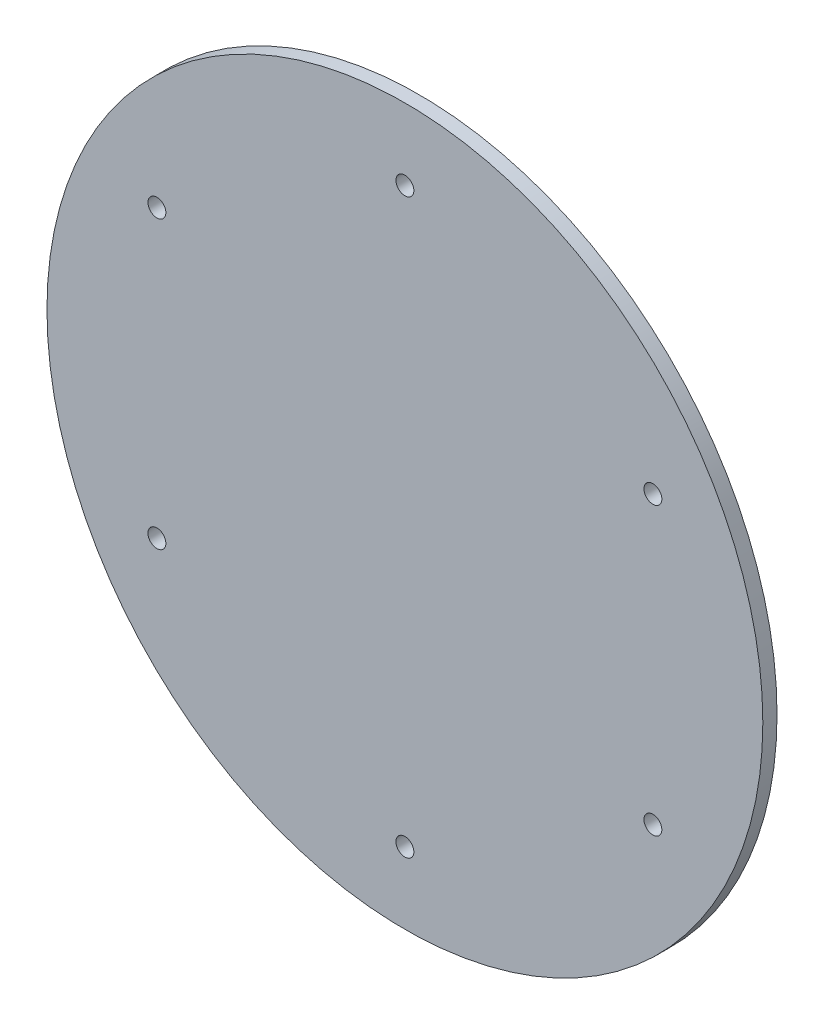
ISO-10303-21;
HEADER;
FILE_DESCRIPTION(('STEP AP214'),'2;1');
FILE_NAME('part.step','',(''),(''),'','','');
FILE_SCHEMA(('AUTOMOTIVE_DESIGN { 1 0 10303 214 1 1 1 1 }'));
ENDSEC;
DATA;
#1=APPLICATION_CONTEXT('core data for automotive mechanical design processes');
#2=APPLICATION_PROTOCOL_DEFINITION('international standard','automotive_design',2000,#1);
#3=PRODUCT_CONTEXT('',#1,'mechanical');
#4=PRODUCT('Part','Part','',(#3));
#5=PRODUCT_RELATED_PRODUCT_CATEGORY('part','',(#4));
#6=PRODUCT_DEFINITION_FORMATION('','',#4);
#7=PRODUCT_DEFINITION_CONTEXT('part definition',#1,'design');
#8=PRODUCT_DEFINITION('design','',#6,#7);
#9=PRODUCT_DEFINITION_SHAPE('','',#8);
#10=(LENGTH_UNIT() NAMED_UNIT(*) SI_UNIT(.MILLI.,.METRE.));
#11=(NAMED_UNIT(*) PLANE_ANGLE_UNIT() SI_UNIT($,.RADIAN.));
#12=(NAMED_UNIT(*) SI_UNIT($,.STERADIAN.) SOLID_ANGLE_UNIT());
#13=UNCERTAINTY_MEASURE_WITH_UNIT(LENGTH_MEASURE(1.E-05),#10,'distance_accuracy_value','');
#14=(GEOMETRIC_REPRESENTATION_CONTEXT(3) GLOBAL_UNCERTAINTY_ASSIGNED_CONTEXT((#13)) GLOBAL_UNIT_ASSIGNED_CONTEXT((#10,
#11,#12)) REPRESENTATION_CONTEXT('',''));
#15=CARTESIAN_POINT('',(0.,0.,0.));
#16=DIRECTION('',(0.,0.,1.));
#17=DIRECTION('',(1.,0.,0.));
#18=AXIS2_PLACEMENT_3D('',#15,#16,#17);
#19=CARTESIAN_POINT('',(0.,0.,3.175));
#20=DIRECTION('',(0.,0.,1.));
#21=DIRECTION('',(1.,0.,0.));
#22=AXIS2_PLACEMENT_3D('',#19,#20,#21);
#23=PLANE('',#22);
#24=CARTESIAN_POINT('',(-55.4256258422,-32.0000000000024,3.175));
#25=DIRECTION('',(0.,0.,1.));
#26=DIRECTION('',(1.,0.,0.));
#27=AXIS2_PLACEMENT_3D('',#24,#25,#26);
#28=CIRCLE('',#27,2.00000000000518);
#29=CARTESIAN_POINT('',(-53.4256258421948,-32.0000000000024,3.175));
#30=VERTEX_POINT('',#29);
#31=EDGE_CURVE('E65',#30,#30,#28,.T.);
#32=ORIENTED_EDGE('',*,*,#31,.F.);
#33=EDGE_LOOP('',(#32));
#34=FACE_BOUND('',#33,.T.);
#35=CARTESIAN_POINT('',(55.4256258422082,-31.9999999999976,3.175));
#36=DIRECTION('',(0.,0.,1.));
#37=DIRECTION('',(1.,0.,0.));
#38=AXIS2_PLACEMENT_3D('',#35,#36,#37);
#39=CIRCLE('',#38,2.00000000000351);
#40=CARTESIAN_POINT('',(57.4256258422117,-31.9999999999976,3.175));
#41=VERTEX_POINT('',#40);
#42=EDGE_CURVE('E53',#41,#41,#39,.T.);
#43=ORIENTED_EDGE('',*,*,#42,.F.);
#44=EDGE_LOOP('',(#43));
#45=FACE_BOUND('',#44,.T.);
#46=CARTESIAN_POINT('',(0.,64.,3.175));
#47=DIRECTION('',(0.,0.,1.));
#48=DIRECTION('',(1.,0.,0.));
#49=AXIS2_PLACEMENT_3D('',#46,#47,#48);
#50=CIRCLE('',#49,2.);
#51=CARTESIAN_POINT('',(2.,64.,3.175));
#52=VERTEX_POINT('',#51);
#53=EDGE_CURVE('E42',#52,#52,#50,.T.);
#54=ORIENTED_EDGE('',*,*,#53,.F.);
#55=EDGE_LOOP('',(#54));
#56=FACE_BOUND('',#55,.T.);
#57=CARTESIAN_POINT('',(0.,0.,3.175));
#58=DIRECTION('',(0.,0.,1.));
#59=DIRECTION('',(1.,0.,0.));
#60=AXIS2_PLACEMENT_3D('',#57,#58,#59);
#61=CIRCLE('',#60,80.);
#62=CARTESIAN_POINT('',(80.,0.,3.175));
#63=VERTEX_POINT('',#62);
#64=EDGE_CURVE('E10',#63,#63,#61,.T.);
#65=ORIENTED_EDGE('',*,*,#64,.T.);
#66=EDGE_LOOP('',(#65));
#67=FACE_BOUND('',#66,.T.);
#68=CARTESIAN_POINT('',(55.4256258422054,32.0000000000024,3.175));
#69=DIRECTION('',(0.,0.,1.));
#70=DIRECTION('',(1.,0.,0.));
#71=AXIS2_PLACEMENT_3D('',#68,#69,#70);
#72=CIRCLE('',#71,2.00000000000077);
#73=CARTESIAN_POINT('',(57.4256258422062,32.0000000000024,3.175));
#74=VERTEX_POINT('',#73);
#75=EDGE_CURVE('E47',#74,#74,#72,.T.);
#76=ORIENTED_EDGE('',*,*,#75,.F.);
#77=EDGE_LOOP('',(#76));
#78=FACE_BOUND('',#77,.T.);
#79=CARTESIAN_POINT('',(5.44129273160848E-12,-64.,3.175));
#80=DIRECTION('',(0.,0.,1.));
#81=DIRECTION('',(1.,0.,0.));
#82=AXIS2_PLACEMENT_3D('',#79,#80,#81);
#83=CIRCLE('',#82,2.00000000000563);
#84=CARTESIAN_POINT('',(2.00000000001107,-64.,3.175));
#85=VERTEX_POINT('',#84);
#86=EDGE_CURVE('E59',#85,#85,#83,.T.);
#87=ORIENTED_EDGE('',*,*,#86,.F.);
#88=EDGE_LOOP('',(#87));
#89=FACE_BOUND('',#88,.T.);
#90=CARTESIAN_POINT('',(-55.4256258422027,31.9999999999976,3.175));
#91=DIRECTION('',(0.,0.,1.));
#92=DIRECTION('',(1.,0.,0.));
#93=AXIS2_PLACEMENT_3D('',#90,#91,#92);
#94=CIRCLE('',#93,2.00000000000275);
#95=CARTESIAN_POINT('',(-53.4256258422,31.9999999999976,3.175));
#96=VERTEX_POINT('',#95);
#97=EDGE_CURVE('E71',#96,#96,#94,.T.);
#98=ORIENTED_EDGE('',*,*,#97,.F.);
#99=EDGE_LOOP('',(#98));
#100=FACE_BOUND('',#99,.T.);
#101=ADVANCED_FACE('F31',(#34,#45,#56,#67,#78,#89,#100),#23,.T.);
#102=CARTESIAN_POINT('',(0.,0.,0.));
#103=DIRECTION('',(0.,0.,1.));
#104=DIRECTION('',(1.,0.,0.));
#105=AXIS2_PLACEMENT_3D('',#102,#103,#104);
#106=PLANE('',#105);
#107=CARTESIAN_POINT('',(-55.4256258422,-32.0000000000024,0.));
#108=DIRECTION('',(0.,0.,1.));
#109=DIRECTION('',(1.,0.,0.));
#110=AXIS2_PLACEMENT_3D('',#107,#108,#109);
#111=CIRCLE('',#110,2.00000000000518);
#112=CARTESIAN_POINT('',(-53.4256258421948,-32.0000000000024,0.));
#113=VERTEX_POINT('',#112);
#114=EDGE_CURVE('E68',#113,#113,#111,.T.);
#115=ORIENTED_EDGE('',*,*,#114,.T.);
#116=EDGE_LOOP('',(#115));
#117=FACE_BOUND('',#116,.T.);
#118=CARTESIAN_POINT('',(55.4256258422082,-31.9999999999976,0.));
#119=DIRECTION('',(0.,0.,1.));
#120=DIRECTION('',(1.,0.,0.));
#121=AXIS2_PLACEMENT_3D('',#118,#119,#120);
#122=CIRCLE('',#121,2.00000000000351);
#123=CARTESIAN_POINT('',(57.4256258422117,-31.9999999999976,0.));
#124=VERTEX_POINT('',#123);
#125=EDGE_CURVE('E56',#124,#124,#122,.T.);
#126=ORIENTED_EDGE('',*,*,#125,.T.);
#127=EDGE_LOOP('',(#126));
#128=FACE_BOUND('',#127,.T.);
#129=CARTESIAN_POINT('',(0.,64.,0.));
#130=DIRECTION('',(0.,0.,1.));
#131=DIRECTION('',(1.,0.,0.));
#132=AXIS2_PLACEMENT_3D('',#129,#130,#131);
#133=CIRCLE('',#132,2.);
#134=CARTESIAN_POINT('',(2.,64.,0.));
#135=VERTEX_POINT('',#134);
#136=EDGE_CURVE('E44',#135,#135,#133,.T.);
#137=ORIENTED_EDGE('',*,*,#136,.T.);
#138=EDGE_LOOP('',(#137));
#139=FACE_BOUND('',#138,.T.);
#140=CARTESIAN_POINT('',(0.,0.,0.));
#141=DIRECTION('',(0.,0.,1.));
#142=DIRECTION('',(1.,0.,0.));
#143=AXIS2_PLACEMENT_3D('',#140,#141,#142);
#144=CIRCLE('',#143,80.);
#145=CARTESIAN_POINT('',(80.,0.,0.));
#146=VERTEX_POINT('',#145);
#147=EDGE_CURVE('E35',#146,#146,#144,.T.);
#148=ORIENTED_EDGE('',*,*,#147,.F.);
#149=EDGE_LOOP('',(#148));
#150=FACE_BOUND('',#149,.T.);
#151=CARTESIAN_POINT('',(55.4256258422054,32.0000000000024,0.));
#152=DIRECTION('',(0.,0.,1.));
#153=DIRECTION('',(1.,0.,0.));
#154=AXIS2_PLACEMENT_3D('',#151,#152,#153);
#155=CIRCLE('',#154,2.00000000000077);
#156=CARTESIAN_POINT('',(57.4256258422062,32.0000000000024,0.));
#157=VERTEX_POINT('',#156);
#158=EDGE_CURVE('E50',#157,#157,#155,.T.);
#159=ORIENTED_EDGE('',*,*,#158,.T.);
#160=EDGE_LOOP('',(#159));
#161=FACE_BOUND('',#160,.T.);
#162=CARTESIAN_POINT('',(5.44129273160848E-12,-64.,0.));
#163=DIRECTION('',(0.,0.,1.));
#164=DIRECTION('',(1.,0.,0.));
#165=AXIS2_PLACEMENT_3D('',#162,#163,#164);
#166=CIRCLE('',#165,2.00000000000563);
#167=CARTESIAN_POINT('',(2.00000000001107,-64.,0.));
#168=VERTEX_POINT('',#167);
#169=EDGE_CURVE('E62',#168,#168,#166,.T.);
#170=ORIENTED_EDGE('',*,*,#169,.T.);
#171=EDGE_LOOP('',(#170));
#172=FACE_BOUND('',#171,.T.);
#173=CARTESIAN_POINT('',(-55.4256258422027,31.9999999999976,0.));
#174=DIRECTION('',(0.,0.,1.));
#175=DIRECTION('',(1.,0.,0.));
#176=AXIS2_PLACEMENT_3D('',#173,#174,#175);
#177=CIRCLE('',#176,2.00000000000275);
#178=CARTESIAN_POINT('',(-53.4256258422,31.9999999999976,0.));
#179=VERTEX_POINT('',#178);
#180=EDGE_CURVE('E74',#179,#179,#177,.T.);
#181=ORIENTED_EDGE('',*,*,#180,.T.);
#182=EDGE_LOOP('',(#181));
#183=FACE_BOUND('',#182,.T.);
#184=ADVANCED_FACE('F84',(#117,#128,#139,#150,#161,#172,#183),#106,.F.);
#185=CARTESIAN_POINT('',(0.,0.,3.175));
#186=DIRECTION('',(0.,0.,-1.));
#187=DIRECTION('',(-1.,0.,0.));
#188=AXIS2_PLACEMENT_3D('',#185,#186,#187);
#189=CYLINDRICAL_SURFACE('',#188,80.);
#190=ORIENTED_EDGE('',*,*,#64,.F.);
#191=EDGE_LOOP('',(#190));
#192=FACE_BOUND('',#191,.T.);
#193=ORIENTED_EDGE('',*,*,#147,.T.);
#194=EDGE_LOOP('',(#193));
#195=FACE_BOUND('',#194,.T.);
#196=ADVANCED_FACE('F33',(#192,#195),#189,.T.);
#197=CARTESIAN_POINT('',(0.,64.,3.175));
#198=DIRECTION('',(0.,0.,-1.));
#199=DIRECTION('',(-1.,0.,0.));
#200=AXIS2_PLACEMENT_3D('',#197,#198,#199);
#201=CYLINDRICAL_SURFACE('',#200,2.);
#202=ORIENTED_EDGE('',*,*,#53,.T.);
#203=EDGE_LOOP('',(#202));
#204=FACE_BOUND('',#203,.T.);
#205=ORIENTED_EDGE('',*,*,#136,.F.);
#206=EDGE_LOOP('',(#205));
#207=FACE_BOUND('',#206,.T.);
#208=ADVANCED_FACE('F94',(#204,#207),#201,.F.);
#209=CARTESIAN_POINT('',(55.4256258422054,32.0000000000024,3.175));
#210=DIRECTION('',(0.,0.,-1.));
#211=DIRECTION('',(-1.,0.,0.));
#212=AXIS2_PLACEMENT_3D('',#209,#210,#211);
#213=CYLINDRICAL_SURFACE('',#212,2.00000000000077);
#214=ORIENTED_EDGE('',*,*,#75,.T.);
#215=EDGE_LOOP('',(#214));
#216=FACE_BOUND('',#215,.T.);
#217=ORIENTED_EDGE('',*,*,#158,.F.);
#218=EDGE_LOOP('',(#217));
#219=FACE_BOUND('',#218,.T.);
#220=ADVANCED_FACE('F97',(#216,#219),#213,.F.);
#221=CARTESIAN_POINT('',(55.4256258422082,-31.9999999999976,3.175));
#222=DIRECTION('',(0.,0.,-1.));
#223=DIRECTION('',(-1.,0.,0.));
#224=AXIS2_PLACEMENT_3D('',#221,#222,#223);
#225=CYLINDRICAL_SURFACE('',#224,2.00000000000351);
#226=ORIENTED_EDGE('',*,*,#42,.T.);
#227=EDGE_LOOP('',(#226));
#228=FACE_BOUND('',#227,.T.);
#229=ORIENTED_EDGE('',*,*,#125,.F.);
#230=EDGE_LOOP('',(#229));
#231=FACE_BOUND('',#230,.T.);
#232=ADVANCED_FACE('F101',(#228,#231),#225,.F.);
#233=CARTESIAN_POINT('',(5.44129273160848E-12,-64.,3.175));
#234=DIRECTION('',(0.,0.,-1.));
#235=DIRECTION('',(-1.,0.,0.));
#236=AXIS2_PLACEMENT_3D('',#233,#234,#235);
#237=CYLINDRICAL_SURFACE('',#236,2.00000000000563);
#238=ORIENTED_EDGE('',*,*,#86,.T.);
#239=EDGE_LOOP('',(#238));
#240=FACE_BOUND('',#239,.T.);
#241=ORIENTED_EDGE('',*,*,#169,.F.);
#242=EDGE_LOOP('',(#241));
#243=FACE_BOUND('',#242,.T.);
#244=ADVANCED_FACE('F105',(#240,#243),#237,.F.);
#245=CARTESIAN_POINT('',(-55.4256258422,-32.0000000000024,3.175));
#246=DIRECTION('',(0.,0.,-1.));
#247=DIRECTION('',(-1.,0.,0.));
#248=AXIS2_PLACEMENT_3D('',#245,#246,#247);
#249=CYLINDRICAL_SURFACE('',#248,2.00000000000518);
#250=ORIENTED_EDGE('',*,*,#31,.T.);
#251=EDGE_LOOP('',(#250));
#252=FACE_BOUND('',#251,.T.);
#253=ORIENTED_EDGE('',*,*,#114,.F.);
#254=EDGE_LOOP('',(#253));
#255=FACE_BOUND('',#254,.T.);
#256=ADVANCED_FACE('F109',(#252,#255),#249,.F.);
#257=CARTESIAN_POINT('',(-55.4256258422027,31.9999999999976,3.175));
#258=DIRECTION('',(0.,0.,-1.));
#259=DIRECTION('',(-1.,0.,0.));
#260=AXIS2_PLACEMENT_3D('',#257,#258,#259);
#261=CYLINDRICAL_SURFACE('',#260,2.00000000000275);
#262=ORIENTED_EDGE('',*,*,#97,.T.);
#263=EDGE_LOOP('',(#262));
#264=FACE_BOUND('',#263,.T.);
#265=ORIENTED_EDGE('',*,*,#180,.F.);
#266=EDGE_LOOP('',(#265));
#267=FACE_BOUND('',#266,.T.);
#268=ADVANCED_FACE('F80',(#264,#267),#261,.F.);
#269=CLOSED_SHELL('',(#101,#184,#196,#208,#220,#232,#244,#256,#268));
#270=MANIFOLD_SOLID_BREP('B2',#269);
#271=ADVANCED_BREP_SHAPE_REPRESENTATION('',(#18,#270),#14);
#272=SHAPE_DEFINITION_REPRESENTATION(#9,#271);
ENDSEC;
END-ISO-10303-21;
